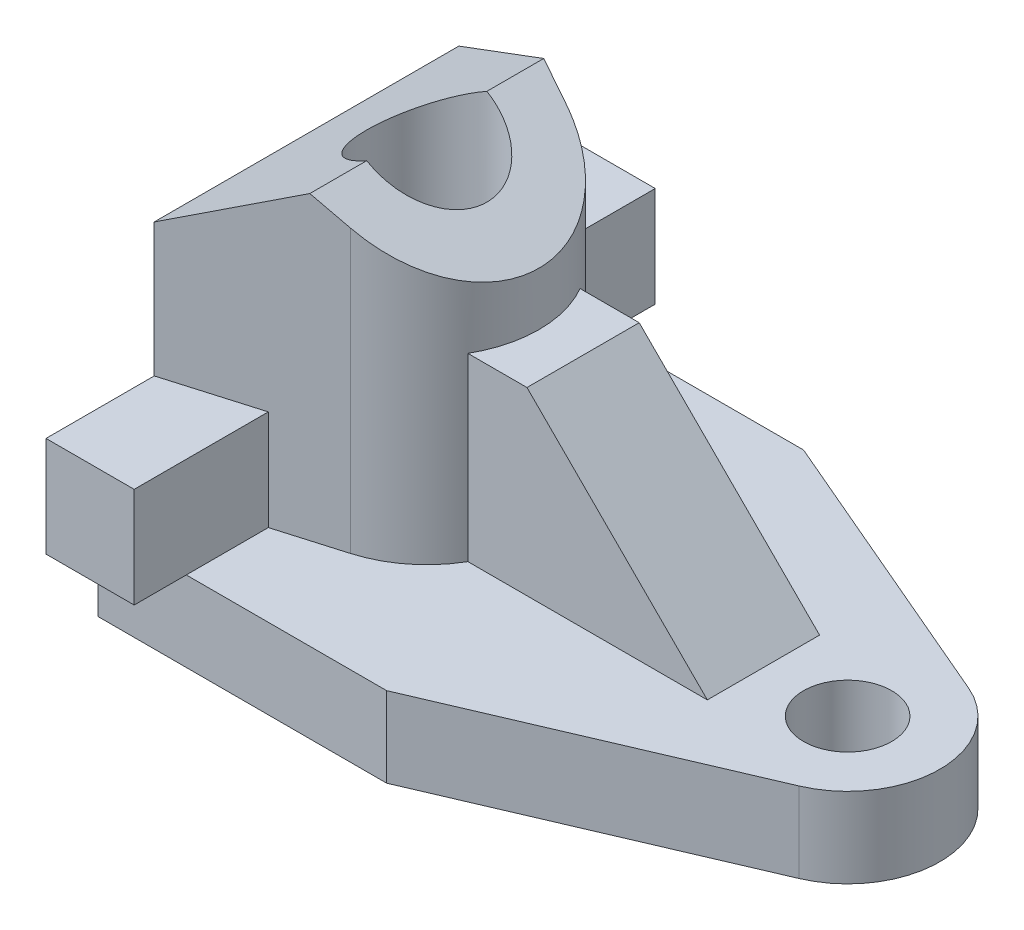
ISO-10303-21;
HEADER;
FILE_DESCRIPTION(('STEP AP214'),'2;1');
FILE_NAME('part.step','',(''),(''),'','','');
FILE_SCHEMA(('AUTOMOTIVE_DESIGN { 1 0 10303 214 1 1 1 1 }'));
ENDSEC;
DATA;
#1=APPLICATION_CONTEXT('core data for automotive mechanical design processes');
#2=APPLICATION_PROTOCOL_DEFINITION('international standard','automotive_design',2000,#1);
#3=PRODUCT_CONTEXT('',#1,'mechanical');
#4=PRODUCT('Part','Part','',(#3));
#5=PRODUCT_RELATED_PRODUCT_CATEGORY('part','',(#4));
#6=PRODUCT_DEFINITION_FORMATION('','',#4);
#7=PRODUCT_DEFINITION_CONTEXT('part definition',#1,'design');
#8=PRODUCT_DEFINITION('design','',#6,#7);
#9=PRODUCT_DEFINITION_SHAPE('','',#8);
#10=(LENGTH_UNIT() NAMED_UNIT(*) SI_UNIT(.MILLI.,.METRE.));
#11=(NAMED_UNIT(*) PLANE_ANGLE_UNIT() SI_UNIT($,.RADIAN.));
#12=(NAMED_UNIT(*) SI_UNIT($,.STERADIAN.) SOLID_ANGLE_UNIT());
#13=UNCERTAINTY_MEASURE_WITH_UNIT(LENGTH_MEASURE(1.E-05),#10,'distance_accuracy_value','');
#14=(GEOMETRIC_REPRESENTATION_CONTEXT(3) GLOBAL_UNCERTAINTY_ASSIGNED_CONTEXT((#13)) GLOBAL_UNIT_ASSIGNED_CONTEXT((#10,
#11,#12)) REPRESENTATION_CONTEXT('',''));
#15=CARTESIAN_POINT('',(0.,0.,0.));
#16=DIRECTION('',(0.,0.,1.));
#17=DIRECTION('',(1.,0.,0.));
#18=AXIS2_PLACEMENT_3D('',#15,#16,#17);
#19=CARTESIAN_POINT('',(-0.226156015931768,47.5,-0.769585411877745));
#20=DIRECTION('',(-0.281945282430885,0.,-0.959430486129646));
#21=DIRECTION('',(-0.959430486129646,0.,0.281945282430885));
#22=AXIS2_PLACEMENT_3D('',#19,#20,#21);
#23=PLANE('',#22);
#24=DIRECTION('',(0.845975230368215,0.471722076970149,-0.248604488500138));
#25=VECTOR('',#24,1.);
#26=CARTESIAN_POINT('',(-11.8582215805571,70.1621577554175,2.64869872468627));
#27=LINE('',#26,#25);
#28=CARTESIAN_POINT('',(-67.5,39.13588849821,19.));
#29=VERTEX_POINT('',#28);
#30=CARTESIAN_POINT('',(-52.5,47.5,14.5919899381936));
#31=VERTEX_POINT('',#30);
#32=EDGE_CURVE('E52',#29,#31,#27,.T.);
#33=ORIENTED_EDGE('',*,*,#32,.F.);
#34=DIRECTION('',(0.,-1.,0.));
#35=VECTOR('',#34,1.);
#36=CARTESIAN_POINT('',(-67.5,47.5,19.));
#37=LINE('',#36,#35);
#38=CARTESIAN_POINT('',(-67.5,22.5,19.));
#39=VERTEX_POINT('',#38);
#40=EDGE_CURVE('E258',#29,#39,#37,.T.);
#41=ORIENTED_EDGE('',*,*,#40,.T.);
#42=DIRECTION('',(0.959430486129646,0.,-0.281945282430885));
#43=VECTOR('',#42,1.);
#44=CARTESIAN_POINT('',(-0.226156015931768,22.5,-0.769585411877745));
#45=LINE('',#44,#43);
#46=CARTESIAN_POINT('',(-56.5,22.5,15.7674592880086));
#47=VERTEX_POINT('',#46);
#48=EDGE_CURVE('E203',#39,#47,#45,.T.);
#49=ORIENTED_EDGE('',*,*,#48,.T.);
#50=DIRECTION('',(0.,-1.,0.));
#51=VECTOR('',#50,1.);
#52=CARTESIAN_POINT('',(-56.5,22.5,15.7674592880086));
#53=LINE('',#52,#51);
#54=CARTESIAN_POINT('',(-56.5,10.,15.7674592880086));
#55=VERTEX_POINT('',#54);
#56=EDGE_CURVE('E266',#47,#55,#53,.T.);
#57=ORIENTED_EDGE('',*,*,#56,.T.);
#58=DIRECTION('',(-0.959430486129646,0.,0.281945282430885));
#59=VECTOR('',#58,1.);
#60=CARTESIAN_POINT('',(-0.226156015931768,10.,-0.769585411877745));
#61=LINE('',#60,#59);
#62=CARTESIAN_POINT('',(-48.5527660459676,10.,13.432026805815));
#63=VERTEX_POINT('',#62);
#64=EDGE_CURVE('E269',#63,#55,#61,.T.);
#65=ORIENTED_EDGE('',*,*,#64,.F.);
#66=DIRECTION('',(0.,-1.,0.));
#67=VECTOR('',#66,1.);
#68=CARTESIAN_POINT('',(-48.5527660459676,47.5,13.432026805815));
#69=LINE('',#68,#67);
#70=CARTESIAN_POINT('',(-48.5527660459676,45.1417782203444,13.432026805815));
#71=VERTEX_POINT('',#70);
#72=EDGE_CURVE('E256',#71,#63,#69,.T.);
#73=ORIENTED_EDGE('',*,*,#72,.F.);
#74=DIRECTION('',(0.832383447651175,-0.497296283457059,-0.244610307501832));
#75=VECTOR('',#74,1.);
#76=CARTESIAN_POINT('',(-13.1536654813518,23.9930622070926,3.02938737463351));
#77=LINE('',#76,#75);
#78=EDGE_CURVE('E213',#31,#71,#77,.T.);
#79=ORIENTED_EDGE('',*,*,#78,.F.);
#80=EDGE_LOOP('',(#33,#41,#49,#57,#65,#73,#79));
#81=FACE_BOUND('',#80,.T.);
#82=ADVANCED_FACE('F37',(#81),#23,.F.);
#83=CARTESIAN_POINT('',(-52.5,47.5,0.));
#84=DIRECTION('',(0.,-1.,0.));
#85=DIRECTION('',(0.,0.,-1.));
#86=AXIS2_PLACEMENT_3D('',#83,#84,#85);
#87=CYLINDRICAL_SURFACE('',#86,14.);
#88=DIRECTION('',(0.,-1.,0.));
#89=VECTOR('',#88,1.);
#90=CARTESIAN_POINT('',(-48.5527660459676,47.5,-13.432026805815));
#91=LINE('',#90,#89);
#92=CARTESIAN_POINT('',(-48.5527660459676,45.1417782203444,-13.432026805815));
#93=VERTEX_POINT('',#92);
#94=CARTESIAN_POINT('',(-48.5527660459676,10.,-13.432026805815));
#95=VERTEX_POINT('',#94);
#96=EDGE_CURVE('E254',#93,#95,#91,.T.);
#97=ORIENTED_EDGE('',*,*,#96,.F.);
#98=CARTESIAN_POINT('',(-52.5,47.5,0.));
#99=DIRECTION('',(0.512876723767168,0.858462268371684,0.));
#100=DIRECTION('',(0.858462268371684,-0.512876723767168,0.));
#101=AXIS2_PLACEMENT_3D('',#98,#99,#100);
#102=ELLIPSE('',#101,16.3082298614649,14.);
#103=EDGE_CURVE('E60',#71,#93,#102,.T.);
#104=ORIENTED_EDGE('',*,*,#103,.F.);
#105=ORIENTED_EDGE('',*,*,#72,.T.);
#106=CARTESIAN_POINT('',(-52.5,10.,0.));
#107=DIRECTION('',(0.,1.,0.));
#108=DIRECTION('',(0.,0.,1.));
#109=AXIS2_PLACEMENT_3D('',#106,#107,#108);
#110=CIRCLE('',#109,14.);
#111=CARTESIAN_POINT('',(-40.3756443470179,10.,7.));
#112=VERTEX_POINT('',#111);
#113=EDGE_CURVE('E271',#112,#63,#110,.F.);
#114=ORIENTED_EDGE('',*,*,#113,.F.);
#115=DIRECTION('',(0.,-1.,0.));
#116=VECTOR('',#115,1.);
#117=CARTESIAN_POINT('',(-40.3756443470179,47.5,7.));
#118=LINE('',#117,#116);
#119=CARTESIAN_POINT('',(-40.3756443470179,32.5,7.));
#120=VERTEX_POINT('',#119);
#121=EDGE_CURVE('E237',#112,#120,#118,.F.);
#122=ORIENTED_EDGE('',*,*,#121,.T.);
#123=CARTESIAN_POINT('',(-52.5,32.5,0.));
#124=DIRECTION('',(0.,-1.,0.));
#125=DIRECTION('',(0.,0.,-1.));
#126=AXIS2_PLACEMENT_3D('',#123,#124,#125);
#127=CIRCLE('',#126,14.);
#128=CARTESIAN_POINT('',(-40.3756443470179,32.5,-7.));
#129=VERTEX_POINT('',#128);
#130=EDGE_CURVE('E242',#120,#129,#127,.F.);
#131=ORIENTED_EDGE('',*,*,#130,.T.);
#132=DIRECTION('',(0.,-1.,0.));
#133=VECTOR('',#132,1.);
#134=CARTESIAN_POINT('',(-40.3756443470179,47.5,-7.));
#135=LINE('',#134,#133);
#136=CARTESIAN_POINT('',(-40.3756443470179,10.,-7.));
#137=VERTEX_POINT('',#136);
#138=EDGE_CURVE('E232',#137,#129,#135,.F.);
#139=ORIENTED_EDGE('',*,*,#138,.F.);
#140=EDGE_CURVE('E272',#95,#137,#110,.F.);
#141=ORIENTED_EDGE('',*,*,#140,.F.);
#142=EDGE_LOOP('',(#97,#104,#105,#114,#122,#131,#139,#141));
#143=FACE_BOUND('',#142,.T.);
#144=ADVANCED_FACE('F388',(#143),#87,.T.);
#145=CARTESIAN_POINT('',(-0.226156015931768,47.5,0.769585411877745));
#146=DIRECTION('',(-0.281945282430885,0.,0.959430486129646));
#147=DIRECTION('',(0.959430486129646,0.,0.281945282430885));
#148=AXIS2_PLACEMENT_3D('',#145,#146,#147);
#149=PLANE('',#148);
#150=DIRECTION('',(-0.845975230368215,-0.471722076970149,-0.248604488500138));
#151=VECTOR('',#150,1.);
#152=CARTESIAN_POINT('',(-11.8582215805571,70.1621577554175,-2.64869872468627));
#153=LINE('',#152,#151);
#154=CARTESIAN_POINT('',(-52.5,47.5,-14.5919899381936));
#155=VERTEX_POINT('',#154);
#156=CARTESIAN_POINT('',(-67.5,39.13588849821,-19.));
#157=VERTEX_POINT('',#156);
#158=EDGE_CURVE('E215',#155,#157,#153,.T.);
#159=ORIENTED_EDGE('',*,*,#158,.F.);
#160=DIRECTION('',(-0.832383447651175,0.497296283457059,-0.244610307501832));
#161=VECTOR('',#160,1.);
#162=CARTESIAN_POINT('',(-13.1536654813518,23.9930622070926,-3.02938737463351));
#163=LINE('',#162,#161);
#164=EDGE_CURVE('E208',#93,#155,#163,.T.);
#165=ORIENTED_EDGE('',*,*,#164,.F.);
#166=ORIENTED_EDGE('',*,*,#96,.T.);
#167=DIRECTION('',(0.959430486129646,0.,0.281945282430885));
#168=VECTOR('',#167,1.);
#169=CARTESIAN_POINT('',(-0.226156015931768,10.,0.769585411877745));
#170=LINE('',#169,#168);
#171=CARTESIAN_POINT('',(-56.5,10.,-15.7674592880086));
#172=VERTEX_POINT('',#171);
#173=EDGE_CURVE('E263',#172,#95,#170,.T.);
#174=ORIENTED_EDGE('',*,*,#173,.F.);
#175=DIRECTION('',(0.,1.,0.));
#176=VECTOR('',#175,1.);
#177=CARTESIAN_POINT('',(-56.5,22.5,-15.7674592880086));
#178=LINE('',#177,#176);
#179=CARTESIAN_POINT('',(-56.5,22.5,-15.7674592880086));
#180=VERTEX_POINT('',#179);
#181=EDGE_CURVE('E260',#172,#180,#178,.T.);
#182=ORIENTED_EDGE('',*,*,#181,.T.);
#183=DIRECTION('',(-0.959430486129646,0.,-0.281945282430885));
#184=VECTOR('',#183,1.);
#185=CARTESIAN_POINT('',(-0.226156015931768,22.5,0.769585411877745));
#186=LINE('',#185,#184);
#187=CARTESIAN_POINT('',(-67.5,22.5,-19.));
#188=VERTEX_POINT('',#187);
#189=EDGE_CURVE('E364',#180,#188,#186,.T.);
#190=ORIENTED_EDGE('',*,*,#189,.T.);
#191=DIRECTION('',(0.,-1.,0.));
#192=VECTOR('',#191,1.);
#193=CARTESIAN_POINT('',(-67.5,47.5,-19.));
#194=LINE('',#193,#192);
#195=EDGE_CURVE('E252',#157,#188,#194,.T.);
#196=ORIENTED_EDGE('',*,*,#195,.F.);
#197=EDGE_LOOP('',(#159,#165,#166,#174,#182,#190,#196));
#198=FACE_BOUND('',#197,.T.);
#199=ADVANCED_FACE('F379',(#198),#149,.F.);
#200=CARTESIAN_POINT('',(-52.5,0.,0.));
#201=DIRECTION('',(0.,1.,0.));
#202=DIRECTION('',(0.,0.,1.));
#203=AXIS2_PLACEMENT_3D('',#200,#201,#202);
#204=CYLINDRICAL_SURFACE('',#203,7.5);
#205=CARTESIAN_POINT('',(-52.5,10.,0.));
#206=DIRECTION('',(0.,1.,0.));
#207=DIRECTION('',(0.,0.,1.));
#208=AXIS2_PLACEMENT_3D('',#205,#206,#207);
#209=CIRCLE('',#208,7.5);
#210=CARTESIAN_POINT('',(-52.5,10.,7.5));
#211=VERTEX_POINT('',#210);
#212=EDGE_CURVE('E247',#211,#211,#209,.T.);
#213=ORIENTED_EDGE('',*,*,#212,.F.);
#214=EDGE_LOOP('',(#213));
#215=FACE_BOUND('',#214,.T.);
#216=CARTESIAN_POINT('',(-52.5,47.5,0.));
#217=DIRECTION('',(-0.48701177071671,0.873395405977942,0.));
#218=DIRECTION('',(0.873395405977942,0.487011770716711,0.));
#219=AXIS2_PLACEMENT_3D('',#216,#217,#218);
#220=ELLIPSE('',#219,8.58717592131394,7.5);
#221=CARTESIAN_POINT('',(-52.5,47.5,7.50000000000003));
#222=VERTEX_POINT('',#221);
#223=CARTESIAN_POINT('',(-52.5,47.5,-7.5));
#224=VERTEX_POINT('',#223);
#225=EDGE_CURVE('E11',#222,#224,#220,.F.);
#226=ORIENTED_EDGE('',*,*,#225,.F.);
#227=CARTESIAN_POINT('',(-52.5,47.5,0.));
#228=DIRECTION('',(0.512876723767168,0.858462268371684,0.));
#229=DIRECTION('',(-0.858462268371684,0.512876723767168,0.));
#230=AXIS2_PLACEMENT_3D('',#227,#228,#229);
#231=ELLIPSE('',#230,8.73655171149906,7.5);
#232=EDGE_CURVE('E45',#224,#222,#231,.F.);
#233=ORIENTED_EDGE('',*,*,#232,.F.);
#234=EDGE_LOOP('',(#226,#233));
#235=FACE_BOUND('',#234,.T.);
#236=ADVANCED_FACE('F191',(#215,#235),#204,.F.);
#237=CARTESIAN_POINT('',(0.,0.,0.));
#238=DIRECTION('',(0.,1.,0.));
#239=DIRECTION('',(0.,0.,1.));
#240=AXIS2_PLACEMENT_3D('',#237,#238,#239);
#241=PLANE('',#240);
#242=CARTESIAN_POINT('',(0.,0.,0.));
#243=DIRECTION('',(0.,1.,0.));
#244=DIRECTION('',(0.,0.,1.));
#245=AXIS2_PLACEMENT_3D('',#242,#243,#244);
#246=CIRCLE('',#245,5.5);
#247=CARTESIAN_POINT('',(0.,0.,5.5));
#248=VERTEX_POINT('',#247);
#249=EDGE_CURVE('E314',#248,#248,#246,.T.);
#250=ORIENTED_EDGE('',*,*,#249,.T.);
#251=EDGE_LOOP('',(#250));
#252=FACE_BOUND('',#251,.T.);
#253=CARTESIAN_POINT('',(-52.5,0.,0.));
#254=DIRECTION('',(0.,1.,0.));
#255=DIRECTION('',(0.,0.,1.));
#256=AXIS2_PLACEMENT_3D('',#253,#254,#255);
#257=CIRCLE('',#256,10.);
#258=CARTESIAN_POINT('',(-52.5,0.,10.));
#259=VERTEX_POINT('',#258);
#260=EDGE_CURVE('E251',#259,#259,#257,.T.);
#261=ORIENTED_EDGE('',*,*,#260,.T.);
#262=EDGE_LOOP('',(#261));
#263=FACE_BOUND('',#262,.T.);
#264=DIRECTION('',(1.,0.,0.));
#265=VECTOR('',#264,1.);
#266=CARTESIAN_POINT('',(-67.5,0.,26.));
#267=LINE('',#266,#265);
#268=CARTESIAN_POINT('',(-67.5,0.,26.));
#269=VERTEX_POINT('',#268);
#270=CARTESIAN_POINT('',(-31.5,0.,26.));
#271=VERTEX_POINT('',#270);
#272=EDGE_CURVE('E339',#269,#271,#267,.T.);
#273=ORIENTED_EDGE('',*,*,#272,.F.);
#274=DIRECTION('',(0.,0.,1.));
#275=VECTOR('',#274,1.);
#276=CARTESIAN_POINT('',(-67.5,0.,-26.));
#277=LINE('',#276,#275);
#278=CARTESIAN_POINT('',(-67.5,0.,-26.));
#279=VERTEX_POINT('',#278);
#280=EDGE_CURVE('E337',#279,#269,#277,.T.);
#281=ORIENTED_EDGE('',*,*,#280,.F.);
#282=DIRECTION('',(-1.,0.,0.));
#283=VECTOR('',#282,1.);
#284=CARTESIAN_POINT('',(-31.5,0.,-26.));
#285=LINE('',#284,#283);
#286=CARTESIAN_POINT('',(-31.5,0.,-26.));
#287=VERTEX_POINT('',#286);
#288=EDGE_CURVE('E317',#287,#279,#285,.T.);
#289=ORIENTED_EDGE('',*,*,#288,.F.);
#290=DIRECTION('',(-0.919252408429625,0.,-0.393668654576833));
#291=VECTOR('',#290,1.);
#292=CARTESIAN_POINT('',(4.52718952763358,0.,-10.5714026969407));
#293=LINE('',#292,#291);
#294=CARTESIAN_POINT('',(4.52718952763358,0.,-10.5714026969407));
#295=VERTEX_POINT('',#294);
#296=EDGE_CURVE('E345',#295,#287,#293,.T.);
#297=ORIENTED_EDGE('',*,*,#296,.F.);
#298=CARTESIAN_POINT('',(0.,0.,0.));
#299=DIRECTION('',(0.,1.,0.));
#300=DIRECTION('',(0.,0.,1.));
#301=AXIS2_PLACEMENT_3D('',#298,#299,#300);
#302=CIRCLE('',#301,11.5);
#303=CARTESIAN_POINT('',(4.52718952763358,0.,10.5714026969407));
#304=VERTEX_POINT('',#303);
#305=EDGE_CURVE('E343',#304,#295,#302,.T.);
#306=ORIENTED_EDGE('',*,*,#305,.F.);
#307=DIRECTION('',(0.919252408429625,0.,-0.393668654576833));
#308=VECTOR('',#307,1.);
#309=CARTESIAN_POINT('',(-31.5,0.,26.));
#310=LINE('',#309,#308);
#311=EDGE_CURVE('E341',#271,#304,#310,.T.);
#312=ORIENTED_EDGE('',*,*,#311,.F.);
#313=EDGE_LOOP('',(#273,#281,#289,#297,#306,#312));
#314=FACE_BOUND('',#313,.T.);
#315=ADVANCED_FACE('F378',(#252,#263,#314),#241,.F.);
#316=CARTESIAN_POINT('',(0.,10.,0.));
#317=DIRECTION('',(0.,1.,0.));
#318=DIRECTION('',(0.,0.,1.));
#319=AXIS2_PLACEMENT_3D('',#316,#317,#318);
#320=PLANE('',#319);
#321=DIRECTION('',(1.,0.,0.));
#322=VECTOR('',#321,1.);
#323=CARTESIAN_POINT('',(0.,10.,7.));
#324=LINE('',#323,#322);
#325=CARTESIAN_POINT('',(-10.5,10.,7.));
#326=VERTEX_POINT('',#325);
#327=EDGE_CURVE('E239',#112,#326,#324,.T.);
#328=ORIENTED_EDGE('',*,*,#327,.F.);
#329=ORIENTED_EDGE('',*,*,#113,.T.);
#330=ORIENTED_EDGE('',*,*,#64,.T.);
#331=DIRECTION('',(0.,0.,-1.));
#332=VECTOR('',#331,1.);
#333=CARTESIAN_POINT('',(-56.5,10.,-32.5));
#334=LINE('',#333,#332);
#335=CARTESIAN_POINT('',(-56.5,10.,26.));
#336=VERTEX_POINT('',#335);
#337=EDGE_CURVE('E294',#336,#55,#334,.T.);
#338=ORIENTED_EDGE('',*,*,#337,.F.);
#339=DIRECTION('',(1.,0.,0.));
#340=VECTOR('',#339,1.);
#341=CARTESIAN_POINT('',(-67.5,10.,26.));
#342=LINE('',#341,#340);
#343=CARTESIAN_POINT('',(-31.5,10.,26.));
#344=VERTEX_POINT('',#343);
#345=EDGE_CURVE('E323',#336,#344,#342,.T.);
#346=ORIENTED_EDGE('',*,*,#345,.T.);
#347=DIRECTION('',(0.919252408429625,0.,-0.393668654576833));
#348=VECTOR('',#347,1.);
#349=CARTESIAN_POINT('',(-31.5,10.,26.));
#350=LINE('',#349,#348);
#351=CARTESIAN_POINT('',(4.52718952763358,10.,10.5714026969407));
#352=VERTEX_POINT('',#351);
#353=EDGE_CURVE('E328',#344,#352,#350,.T.);
#354=ORIENTED_EDGE('',*,*,#353,.T.);
#355=CARTESIAN_POINT('',(0.,10.,0.));
#356=DIRECTION('',(0.,1.,0.));
#357=DIRECTION('',(0.,0.,1.));
#358=AXIS2_PLACEMENT_3D('',#355,#356,#357);
#359=CIRCLE('',#358,11.5);
#360=CARTESIAN_POINT('',(4.52718952763358,10.,-10.5714026969407));
#361=VERTEX_POINT('',#360);
#362=EDGE_CURVE('E330',#352,#361,#359,.T.);
#363=ORIENTED_EDGE('',*,*,#362,.T.);
#364=DIRECTION('',(-0.919252408429625,0.,-0.393668654576833));
#365=VECTOR('',#364,1.);
#366=CARTESIAN_POINT('',(4.52718952763358,10.,-10.5714026969407));
#367=LINE('',#366,#365);
#368=CARTESIAN_POINT('',(-31.5,10.,-26.));
#369=VERTEX_POINT('',#368);
#370=EDGE_CURVE('E332',#361,#369,#367,.T.);
#371=ORIENTED_EDGE('',*,*,#370,.T.);
#372=DIRECTION('',(-1.,0.,0.));
#373=VECTOR('',#372,1.);
#374=CARTESIAN_POINT('',(-31.5,10.,-26.));
#375=LINE('',#374,#373);
#376=CARTESIAN_POINT('',(-56.5,10.,-26.));
#377=VERTEX_POINT('',#376);
#378=EDGE_CURVE('E320',#369,#377,#375,.T.);
#379=ORIENTED_EDGE('',*,*,#378,.T.);
#380=EDGE_CURVE('E293',#172,#377,#334,.T.);
#381=ORIENTED_EDGE('',*,*,#380,.F.);
#382=ORIENTED_EDGE('',*,*,#173,.T.);
#383=ORIENTED_EDGE('',*,*,#140,.T.);
#384=DIRECTION('',(1.,0.,0.));
#385=VECTOR('',#384,1.);
#386=CARTESIAN_POINT('',(0.,10.,-7.));
#387=LINE('',#386,#385);
#388=CARTESIAN_POINT('',(-10.5,10.,-7.));
#389=VERTEX_POINT('',#388);
#390=EDGE_CURVE('E235',#137,#389,#387,.T.);
#391=ORIENTED_EDGE('',*,*,#390,.T.);
#392=DIRECTION('',(0.,0.,1.));
#393=VECTOR('',#392,1.);
#394=CARTESIAN_POINT('',(-10.5,10.,0.));
#395=LINE('',#394,#393);
#396=EDGE_CURVE('E244',#326,#389,#395,.F.);
#397=ORIENTED_EDGE('',*,*,#396,.F.);
#398=EDGE_LOOP('',(#328,#329,#330,#338,#346,#354,#363,#371,#379,#381,#382,#383,#391,#397));
#399=FACE_BOUND('',#398,.T.);
#400=CARTESIAN_POINT('',(0.,10.,0.));
#401=DIRECTION('',(0.,1.,0.));
#402=DIRECTION('',(0.,0.,1.));
#403=AXIS2_PLACEMENT_3D('',#400,#401,#402);
#404=CIRCLE('',#403,5.5);
#405=CARTESIAN_POINT('',(0.,10.,5.5));
#406=VERTEX_POINT('',#405);
#407=EDGE_CURVE('E313',#406,#406,#404,.T.);
#408=ORIENTED_EDGE('',*,*,#407,.F.);
#409=EDGE_LOOP('',(#408));
#410=FACE_BOUND('',#409,.T.);
#411=ADVANCED_FACE('F385',(#399,#410),#320,.T.);
#412=CARTESIAN_POINT('',(-56.5,22.5,-32.5));
#413=DIRECTION('',(-1.,0.,0.));
#414=DIRECTION('',(0.,0.,1.));
#415=AXIS2_PLACEMENT_3D('',#412,#413,#414);
#416=PLANE('',#415);
#417=ORIENTED_EDGE('',*,*,#56,.F.);
#418=DIRECTION('',(0.,0.,-1.));
#419=VECTOR('',#418,1.);
#420=CARTESIAN_POINT('',(-56.5,22.5,-32.5));
#421=LINE('',#420,#419);
#422=CARTESIAN_POINT('',(-56.5,22.5,32.5));
#423=VERTEX_POINT('',#422);
#424=EDGE_CURVE('E276',#423,#47,#421,.T.);
#425=ORIENTED_EDGE('',*,*,#424,.F.);
#426=DIRECTION('',(0.,-1.,0.));
#427=VECTOR('',#426,1.);
#428=CARTESIAN_POINT('',(-56.5,22.5,32.5));
#429=LINE('',#428,#427);
#430=CARTESIAN_POINT('',(-56.5,10.,32.5));
#431=VERTEX_POINT('',#430);
#432=EDGE_CURVE('E288',#423,#431,#429,.T.);
#433=ORIENTED_EDGE('',*,*,#432,.T.);
#434=EDGE_CURVE('E289',#431,#336,#334,.T.);
#435=ORIENTED_EDGE('',*,*,#434,.T.);
#436=ORIENTED_EDGE('',*,*,#337,.T.);
#437=EDGE_LOOP('',(#417,#425,#433,#435,#436));
#438=FACE_BOUND('',#437,.T.);
#439=ADVANCED_FACE('F420',(#438),#416,.F.);
#440=ORIENTED_EDGE('',*,*,#181,.F.);
#441=ORIENTED_EDGE('',*,*,#380,.T.);
#442=CARTESIAN_POINT('',(-56.5,10.,-32.5));
#443=VERTEX_POINT('',#442);
#444=EDGE_CURVE('E275',#377,#443,#334,.T.);
#445=ORIENTED_EDGE('',*,*,#444,.T.);
#446=DIRECTION('',(0.,-1.,0.));
#447=VECTOR('',#446,1.);
#448=CARTESIAN_POINT('',(-56.5,22.5,-32.5));
#449=LINE('',#448,#447);
#450=CARTESIAN_POINT('',(-56.5,22.5,-32.5));
#451=VERTEX_POINT('',#450);
#452=EDGE_CURVE('E310',#451,#443,#449,.T.);
#453=ORIENTED_EDGE('',*,*,#452,.F.);
#454=EDGE_CURVE('E280',#180,#451,#421,.T.);
#455=ORIENTED_EDGE('',*,*,#454,.F.);
#456=EDGE_LOOP('',(#440,#441,#445,#453,#455));
#457=FACE_BOUND('',#456,.T.);
#458=ADVANCED_FACE('F404',(#457),#416,.F.);
#459=CARTESIAN_POINT('',(0.,22.5,0.));
#460=DIRECTION('',(0.,-1.,0.));
#461=DIRECTION('',(0.,0.,-1.));
#462=AXIS2_PLACEMENT_3D('',#459,#460,#461);
#463=PLANE('',#462);
#464=ORIENTED_EDGE('',*,*,#48,.F.);
#465=DIRECTION('',(0.,0.,1.));
#466=VECTOR('',#465,1.);
#467=CARTESIAN_POINT('',(-67.5,22.5,-32.5));
#468=LINE('',#467,#466);
#469=CARTESIAN_POINT('',(-67.5,22.5,32.5));
#470=VERTEX_POINT('',#469);
#471=EDGE_CURVE('E282',#39,#470,#468,.T.);
#472=ORIENTED_EDGE('',*,*,#471,.T.);
#473=DIRECTION('',(1.,0.,0.));
#474=VECTOR('',#473,1.);
#475=CARTESIAN_POINT('',(-56.5,22.5,32.5));
#476=LINE('',#475,#474);
#477=EDGE_CURVE('E286',#470,#423,#476,.T.);
#478=ORIENTED_EDGE('',*,*,#477,.T.);
#479=ORIENTED_EDGE('',*,*,#424,.T.);
#480=EDGE_LOOP('',(#464,#472,#478,#479));
#481=FACE_BOUND('',#480,.T.);
#482=ADVANCED_FACE('F400',(#481),#463,.F.);
#483=ORIENTED_EDGE('',*,*,#189,.F.);
#484=ORIENTED_EDGE('',*,*,#454,.T.);
#485=DIRECTION('',(-1.,0.,0.));
#486=VECTOR('',#485,1.);
#487=CARTESIAN_POINT('',(-56.5,22.5,-32.5));
#488=LINE('',#487,#486);
#489=CARTESIAN_POINT('',(-67.5,22.5,-32.5));
#490=VERTEX_POINT('',#489);
#491=EDGE_CURVE('E279',#451,#490,#488,.T.);
#492=ORIENTED_EDGE('',*,*,#491,.T.);
#493=EDGE_CURVE('E283',#490,#188,#468,.T.);
#494=ORIENTED_EDGE('',*,*,#493,.T.);
#495=EDGE_LOOP('',(#483,#484,#492,#494));
#496=FACE_BOUND('',#495,.T.);
#497=ADVANCED_FACE('F403',(#496),#463,.F.);
#498=CARTESIAN_POINT('',(-31.5,10.,-26.));
#499=DIRECTION('',(0.,0.,1.));
#500=DIRECTION('',(1.,0.,0.));
#501=AXIS2_PLACEMENT_3D('',#498,#499,#500);
#502=PLANE('',#501);
#503=ORIENTED_EDGE('',*,*,#288,.T.);
#504=DIRECTION('',(0.,-1.,0.));
#505=VECTOR('',#504,1.);
#506=CARTESIAN_POINT('',(-67.5,10.,-26.));
#507=LINE('',#506,#505);
#508=CARTESIAN_POINT('',(-67.5,10.,-26.));
#509=VERTEX_POINT('',#508);
#510=EDGE_CURVE('E361',#509,#279,#507,.T.);
#511=ORIENTED_EDGE('',*,*,#510,.F.);
#512=EDGE_CURVE('E324',#377,#509,#375,.T.);
#513=ORIENTED_EDGE('',*,*,#512,.F.);
#514=ORIENTED_EDGE('',*,*,#378,.F.);
#515=DIRECTION('',(0.,-1.,0.));
#516=VECTOR('',#515,1.);
#517=CARTESIAN_POINT('',(-31.5,10.,-26.));
#518=LINE('',#517,#516);
#519=EDGE_CURVE('E334',#369,#287,#518,.T.);
#520=ORIENTED_EDGE('',*,*,#519,.T.);
#521=EDGE_LOOP('',(#503,#511,#513,#514,#520));
#522=FACE_BOUND('',#521,.T.);
#523=ADVANCED_FACE('F39',(#522),#502,.F.);
#524=CARTESIAN_POINT('',(-67.5,10.,-26.));
#525=DIRECTION('',(1.,0.,0.));
#526=DIRECTION('',(0.,0.,-1.));
#527=AXIS2_PLACEMENT_3D('',#524,#525,#526);
#528=PLANE('',#527);
#529=ORIENTED_EDGE('',*,*,#40,.F.);
#530=DIRECTION('',(0.,0.,-1.));
#531=VECTOR('',#530,1.);
#532=CARTESIAN_POINT('',(-67.5,39.13588849821,173.491189884333));
#533=LINE('',#532,#531);
#534=EDGE_CURVE('E206',#29,#157,#533,.T.);
#535=ORIENTED_EDGE('',*,*,#534,.T.);
#536=ORIENTED_EDGE('',*,*,#195,.T.);
#537=ORIENTED_EDGE('',*,*,#493,.F.);
#538=DIRECTION('',(0.,-1.,0.));
#539=VECTOR('',#538,1.);
#540=CARTESIAN_POINT('',(-67.5,22.5,-32.5));
#541=LINE('',#540,#539);
#542=CARTESIAN_POINT('',(-67.5,10.,-32.5));
#543=VERTEX_POINT('',#542);
#544=EDGE_CURVE('E307',#490,#543,#541,.T.);
#545=ORIENTED_EDGE('',*,*,#544,.T.);
#546=DIRECTION('',(0.,0.,1.));
#547=VECTOR('',#546,1.);
#548=CARTESIAN_POINT('',(-67.5,10.,-32.5));
#549=LINE('',#548,#547);
#550=EDGE_CURVE('E297',#543,#509,#549,.T.);
#551=ORIENTED_EDGE('',*,*,#550,.T.);
#552=ORIENTED_EDGE('',*,*,#510,.T.);
#553=ORIENTED_EDGE('',*,*,#280,.T.);
#554=DIRECTION('',(0.,-1.,0.));
#555=VECTOR('',#554,1.);
#556=CARTESIAN_POINT('',(-67.5,10.,26.));
#557=LINE('',#556,#555);
#558=CARTESIAN_POINT('',(-67.5,10.,26.));
#559=VERTEX_POINT('',#558);
#560=EDGE_CURVE('E358',#559,#269,#557,.T.);
#561=ORIENTED_EDGE('',*,*,#560,.F.);
#562=CARTESIAN_POINT('',(-67.5,10.,32.5));
#563=VERTEX_POINT('',#562);
#564=EDGE_CURVE('E296',#559,#563,#549,.T.);
#565=ORIENTED_EDGE('',*,*,#564,.T.);
#566=DIRECTION('',(0.,-1.,0.));
#567=VECTOR('',#566,1.);
#568=CARTESIAN_POINT('',(-67.5,22.5,32.5));
#569=LINE('',#568,#567);
#570=EDGE_CURVE('E304',#470,#563,#569,.T.);
#571=ORIENTED_EDGE('',*,*,#570,.F.);
#572=ORIENTED_EDGE('',*,*,#471,.F.);
#573=EDGE_LOOP('',(#529,#535,#536,#537,#545,#551,#552,#553,#561,#565,#571,#572));
#574=FACE_BOUND('',#573,.T.);
#575=ADVANCED_FACE('F445',(#574),#528,.F.);
#576=CARTESIAN_POINT('',(-67.5,10.,26.));
#577=DIRECTION('',(0.,0.,-1.));
#578=DIRECTION('',(-1.,0.,0.));
#579=AXIS2_PLACEMENT_3D('',#576,#577,#578);
#580=PLANE('',#579);
#581=ORIENTED_EDGE('',*,*,#272,.T.);
#582=DIRECTION('',(0.,-1.,0.));
#583=VECTOR('',#582,1.);
#584=CARTESIAN_POINT('',(-31.5,10.,26.));
#585=LINE('',#584,#583);
#586=EDGE_CURVE('E355',#344,#271,#585,.T.);
#587=ORIENTED_EDGE('',*,*,#586,.F.);
#588=ORIENTED_EDGE('',*,*,#345,.F.);
#589=EDGE_CURVE('E325',#559,#336,#342,.T.);
#590=ORIENTED_EDGE('',*,*,#589,.F.);
#591=ORIENTED_EDGE('',*,*,#560,.T.);
#592=EDGE_LOOP('',(#581,#587,#588,#590,#591));
#593=FACE_BOUND('',#592,.T.);
#594=ADVANCED_FACE('F442',(#593),#580,.F.);
#595=CARTESIAN_POINT('',(-31.5,10.,26.));
#596=DIRECTION('',(-0.393668654576833,0.,-0.919252408429625));
#597=DIRECTION('',(-0.919252408429625,0.,0.393668654576833));
#598=AXIS2_PLACEMENT_3D('',#595,#596,#597);
#599=PLANE('',#598);
#600=ORIENTED_EDGE('',*,*,#311,.T.);
#601=DIRECTION('',(0.,-1.,0.));
#602=VECTOR('',#601,1.);
#603=CARTESIAN_POINT('',(4.52718952763358,10.,10.5714026969407));
#604=LINE('',#603,#602);
#605=EDGE_CURVE('E352',#352,#304,#604,.T.);
#606=ORIENTED_EDGE('',*,*,#605,.F.);
#607=ORIENTED_EDGE('',*,*,#353,.F.);
#608=ORIENTED_EDGE('',*,*,#586,.T.);
#609=EDGE_LOOP('',(#600,#606,#607,#608));
#610=FACE_BOUND('',#609,.T.);
#611=ADVANCED_FACE('F438',(#610),#599,.F.);
#612=CARTESIAN_POINT('',(0.,10.,0.));
#613=DIRECTION('',(0.,-1.,0.));
#614=DIRECTION('',(0.,0.,-1.));
#615=AXIS2_PLACEMENT_3D('',#612,#613,#614);
#616=CYLINDRICAL_SURFACE('',#615,11.5);
#617=ORIENTED_EDGE('',*,*,#305,.T.);
#618=DIRECTION('',(0.,-1.,0.));
#619=VECTOR('',#618,1.);
#620=CARTESIAN_POINT('',(4.52718952763358,10.,-10.5714026969407));
#621=LINE('',#620,#619);
#622=EDGE_CURVE('E349',#361,#295,#621,.T.);
#623=ORIENTED_EDGE('',*,*,#622,.F.);
#624=ORIENTED_EDGE('',*,*,#362,.F.);
#625=ORIENTED_EDGE('',*,*,#605,.T.);
#626=EDGE_LOOP('',(#617,#623,#624,#625));
#627=FACE_BOUND('',#626,.T.);
#628=ADVANCED_FACE('F434',(#627),#616,.T.);
#629=CARTESIAN_POINT('',(4.52718952763358,10.,-10.5714026969407));
#630=DIRECTION('',(-0.393668654576833,0.,0.919252408429625));
#631=DIRECTION('',(0.919252408429625,0.,0.393668654576833));
#632=AXIS2_PLACEMENT_3D('',#629,#630,#631);
#633=PLANE('',#632);
#634=ORIENTED_EDGE('',*,*,#296,.T.);
#635=ORIENTED_EDGE('',*,*,#519,.F.);
#636=ORIENTED_EDGE('',*,*,#370,.F.);
#637=ORIENTED_EDGE('',*,*,#622,.T.);
#638=EDGE_LOOP('',(#634,#635,#636,#637));
#639=FACE_BOUND('',#638,.T.);
#640=ADVANCED_FACE('F427',(#639),#633,.F.);
#641=CARTESIAN_POINT('',(0.,0.,0.));
#642=DIRECTION('',(0.,1.,0.));
#643=DIRECTION('',(0.,0.,1.));
#644=AXIS2_PLACEMENT_3D('',#641,#642,#643);
#645=CYLINDRICAL_SURFACE('',#644,5.5);
#646=ORIENTED_EDGE('',*,*,#249,.F.);
#647=EDGE_LOOP('',(#646));
#648=FACE_BOUND('',#647,.T.);
#649=ORIENTED_EDGE('',*,*,#407,.T.);
#650=EDGE_LOOP('',(#649));
#651=FACE_BOUND('',#650,.T.);
#652=ADVANCED_FACE('F424',(#648,#651),#645,.F.);
#653=CARTESIAN_POINT('',(0.,10.,0.));
#654=DIRECTION('',(0.,-1.,0.));
#655=DIRECTION('',(0.,0.,-1.));
#656=AXIS2_PLACEMENT_3D('',#653,#654,#655);
#657=PLANE('',#656);
#658=ORIENTED_EDGE('',*,*,#444,.F.);
#659=ORIENTED_EDGE('',*,*,#512,.T.);
#660=ORIENTED_EDGE('',*,*,#550,.F.);
#661=DIRECTION('',(-1.,0.,0.));
#662=VECTOR('',#661,1.);
#663=CARTESIAN_POINT('',(-56.5,10.,-32.5));
#664=LINE('',#663,#662);
#665=EDGE_CURVE('E292',#443,#543,#664,.T.);
#666=ORIENTED_EDGE('',*,*,#665,.F.);
#667=EDGE_LOOP('',(#658,#659,#660,#666));
#668=FACE_BOUND('',#667,.T.);
#669=ADVANCED_FACE('F412',(#668),#657,.T.);
#670=CARTESIAN_POINT('',(-56.5,22.5,-32.5));
#671=DIRECTION('',(0.,0.,1.));
#672=DIRECTION('',(1.,0.,0.));
#673=AXIS2_PLACEMENT_3D('',#670,#671,#672);
#674=PLANE('',#673);
#675=ORIENTED_EDGE('',*,*,#665,.T.);
#676=ORIENTED_EDGE('',*,*,#544,.F.);
#677=ORIENTED_EDGE('',*,*,#491,.F.);
#678=ORIENTED_EDGE('',*,*,#452,.T.);
#679=EDGE_LOOP('',(#675,#676,#677,#678));
#680=FACE_BOUND('',#679,.T.);
#681=ADVANCED_FACE('F415',(#680),#674,.F.);
#682=CARTESIAN_POINT('',(-56.5,22.5,32.5));
#683=DIRECTION('',(0.,0.,-1.));
#684=DIRECTION('',(-1.,0.,0.));
#685=AXIS2_PLACEMENT_3D('',#682,#683,#684);
#686=PLANE('',#685);
#687=DIRECTION('',(1.,0.,0.));
#688=VECTOR('',#687,1.);
#689=CARTESIAN_POINT('',(-56.5,10.,32.5));
#690=LINE('',#689,#688);
#691=EDGE_CURVE('E300',#563,#431,#690,.T.);
#692=ORIENTED_EDGE('',*,*,#691,.T.);
#693=ORIENTED_EDGE('',*,*,#432,.F.);
#694=ORIENTED_EDGE('',*,*,#477,.F.);
#695=ORIENTED_EDGE('',*,*,#570,.T.);
#696=EDGE_LOOP('',(#692,#693,#694,#695));
#697=FACE_BOUND('',#696,.T.);
#698=ADVANCED_FACE('F410',(#697),#686,.F.);
#699=ORIENTED_EDGE('',*,*,#564,.F.);
#700=ORIENTED_EDGE('',*,*,#589,.T.);
#701=ORIENTED_EDGE('',*,*,#434,.F.);
#702=ORIENTED_EDGE('',*,*,#691,.F.);
#703=EDGE_LOOP('',(#699,#700,#701,#702));
#704=FACE_BOUND('',#703,.T.);
#705=ADVANCED_FACE('F406',(#704),#657,.T.);
#706=CARTESIAN_POINT('',(-52.5,10.,0.));
#707=DIRECTION('',(0.,1.,0.));
#708=DIRECTION('',(0.,0.,1.));
#709=AXIS2_PLACEMENT_3D('',#706,#707,#708);
#710=CYLINDRICAL_SURFACE('',#709,10.);
#711=ORIENTED_EDGE('',*,*,#260,.F.);
#712=EDGE_LOOP('',(#711));
#713=FACE_BOUND('',#712,.T.);
#714=CARTESIAN_POINT('',(-52.5,10.,0.));
#715=DIRECTION('',(0.,1.,0.));
#716=DIRECTION('',(0.,0.,1.));
#717=AXIS2_PLACEMENT_3D('',#714,#715,#716);
#718=CIRCLE('',#717,10.);
#719=CARTESIAN_POINT('',(-52.5,10.,10.));
#720=VERTEX_POINT('',#719);
#721=EDGE_CURVE('E248',#720,#720,#718,.T.);
#722=ORIENTED_EDGE('',*,*,#721,.T.);
#723=EDGE_LOOP('',(#722));
#724=FACE_BOUND('',#723,.T.);
#725=ADVANCED_FACE('F409',(#713,#724),#710,.F.);
#726=CARTESIAN_POINT('',(-42.5,10.,0.));
#727=DIRECTION('',(0.,1.,0.));
#728=DIRECTION('',(0.,0.,1.));
#729=AXIS2_PLACEMENT_3D('',#726,#727,#728);
#730=PLANE('',#729);
#731=ORIENTED_EDGE('',*,*,#212,.T.);
#732=EDGE_LOOP('',(#731));
#733=FACE_BOUND('',#732,.T.);
#734=ORIENTED_EDGE('',*,*,#721,.F.);
#735=EDGE_LOOP('',(#734));
#736=FACE_BOUND('',#735,.T.);
#737=ADVANCED_FACE('F374',(#733,#736),#730,.F.);
#738=CARTESIAN_POINT('',(-38.5,32.5,0.));
#739=DIRECTION('',(0.,-1.,0.));
#740=DIRECTION('',(1.,0.,0.));
#741=AXIS2_PLACEMENT_3D('',#738,#739,#740);
#742=PLANE('',#741);
#743=ORIENTED_EDGE('',*,*,#130,.F.);
#744=DIRECTION('',(1.,0.,0.));
#745=VECTOR('',#744,1.);
#746=CARTESIAN_POINT('',(-28.,32.5,7.));
#747=LINE('',#746,#745);
#748=CARTESIAN_POINT('',(-32.9999999999999,32.5,7.));
#749=VERTEX_POINT('',#748);
#750=EDGE_CURVE('E220',#120,#749,#747,.T.);
#751=ORIENTED_EDGE('',*,*,#750,.T.);
#752=DIRECTION('',(0.,0.,1.));
#753=VECTOR('',#752,1.);
#754=CARTESIAN_POINT('',(-32.9999999999999,32.5,0.));
#755=LINE('',#754,#753);
#756=CARTESIAN_POINT('',(-32.9999999999999,32.5,-7.));
#757=VERTEX_POINT('',#756);
#758=EDGE_CURVE('E222',#757,#749,#755,.T.);
#759=ORIENTED_EDGE('',*,*,#758,.F.);
#760=DIRECTION('',(1.,0.,0.));
#761=VECTOR('',#760,1.);
#762=CARTESIAN_POINT('',(-28.,32.5,-7.));
#763=LINE('',#762,#761);
#764=EDGE_CURVE('E226',#129,#757,#763,.T.);
#765=ORIENTED_EDGE('',*,*,#764,.F.);
#766=EDGE_LOOP('',(#743,#751,#759,#765));
#767=FACE_BOUND('',#766,.T.);
#768=ADVANCED_FACE('F475',(#767),#742,.F.);
#769=CARTESIAN_POINT('',(-28.,23.75,7.));
#770=DIRECTION('',(0.,0.,1.));
#771=DIRECTION('',(1.,0.,0.));
#772=AXIS2_PLACEMENT_3D('',#769,#770,#771);
#773=PLANE('',#772);
#774=ORIENTED_EDGE('',*,*,#121,.F.);
#775=ORIENTED_EDGE('',*,*,#327,.T.);
#776=DIRECTION('',(0.707106781186546,-0.707106781186549,0.));
#777=VECTOR('',#776,1.);
#778=CARTESIAN_POINT('',(-32.9999999999999,32.5,7.));
#779=LINE('',#778,#777);
#780=EDGE_CURVE('E223',#749,#326,#779,.T.);
#781=ORIENTED_EDGE('',*,*,#780,.F.);
#782=ORIENTED_EDGE('',*,*,#750,.F.);
#783=EDGE_LOOP('',(#774,#775,#781,#782));
#784=FACE_BOUND('',#783,.T.);
#785=ADVANCED_FACE('F466',(#784),#773,.T.);
#786=CARTESIAN_POINT('',(-28.,23.75,-7.));
#787=DIRECTION('',(0.,0.,1.));
#788=DIRECTION('',(1.,0.,0.));
#789=AXIS2_PLACEMENT_3D('',#786,#787,#788);
#790=PLANE('',#789);
#791=ORIENTED_EDGE('',*,*,#390,.F.);
#792=ORIENTED_EDGE('',*,*,#138,.T.);
#793=ORIENTED_EDGE('',*,*,#764,.T.);
#794=DIRECTION('',(0.707106781186546,-0.707106781186549,0.));
#795=VECTOR('',#794,1.);
#796=CARTESIAN_POINT('',(-32.9999999999999,32.5,-7.));
#797=LINE('',#796,#795);
#798=EDGE_CURVE('E219',#757,#389,#797,.T.);
#799=ORIENTED_EDGE('',*,*,#798,.T.);
#800=EDGE_LOOP('',(#791,#792,#793,#799));
#801=FACE_BOUND('',#800,.T.);
#802=ADVANCED_FACE('F479',(#801),#790,.F.);
#803=CARTESIAN_POINT('',(-32.9999999999999,32.5,0.));
#804=DIRECTION('',(-0.707106781186549,-0.707106781186546,0.));
#805=DIRECTION('',(0.707106781186546,-0.707106781186549,0.));
#806=AXIS2_PLACEMENT_3D('',#803,#804,#805);
#807=PLANE('',#806);
#808=ORIENTED_EDGE('',*,*,#780,.T.);
#809=ORIENTED_EDGE('',*,*,#396,.T.);
#810=ORIENTED_EDGE('',*,*,#798,.F.);
#811=ORIENTED_EDGE('',*,*,#758,.T.);
#812=EDGE_LOOP('',(#808,#809,#810,#811));
#813=FACE_BOUND('',#812,.T.);
#814=ADVANCED_FACE('F469',(#813),#807,.F.);
#815=CARTESIAN_POINT('',(-67.5,39.13588849821,173.491189884333));
#816=DIRECTION('',(-0.48701177071671,0.873395405977942,0.));
#817=DIRECTION('',(-0.873395405977942,-0.48701177071671,0.));
#818=AXIS2_PLACEMENT_3D('',#815,#816,#817);
#819=PLANE('',#818);
#820=ORIENTED_EDGE('',*,*,#534,.F.);
#821=ORIENTED_EDGE('',*,*,#32,.T.);
#822=DIRECTION('',(0.,0.,-1.));
#823=VECTOR('',#822,1.);
#824=CARTESIAN_POINT('',(-52.5,47.5,173.491189884333));
#825=LINE('',#824,#823);
#826=EDGE_CURVE('E200',#31,#222,#825,.T.);
#827=ORIENTED_EDGE('',*,*,#826,.T.);
#828=ORIENTED_EDGE('',*,*,#225,.T.);
#829=EDGE_CURVE('E202',#224,#155,#825,.T.);
#830=ORIENTED_EDGE('',*,*,#829,.T.);
#831=ORIENTED_EDGE('',*,*,#158,.T.);
#832=EDGE_LOOP('',(#820,#821,#827,#828,#830,#831));
#833=FACE_BOUND('',#832,.T.);
#834=ADVANCED_FACE('F205',(#833),#819,.T.);
#835=CARTESIAN_POINT('',(-52.5,47.5,173.491189884333));
#836=DIRECTION('',(0.512876723767168,0.858462268371684,0.));
#837=DIRECTION('',(-0.858462268371684,0.512876723767168,0.));
#838=AXIS2_PLACEMENT_3D('',#835,#836,#837);
#839=PLANE('',#838);
#840=ORIENTED_EDGE('',*,*,#826,.F.);
#841=ORIENTED_EDGE('',*,*,#78,.T.);
#842=ORIENTED_EDGE('',*,*,#103,.T.);
#843=ORIENTED_EDGE('',*,*,#164,.T.);
#844=ORIENTED_EDGE('',*,*,#829,.F.);
#845=ORIENTED_EDGE('',*,*,#232,.T.);
#846=EDGE_LOOP('',(#840,#841,#842,#843,#844,#845));
#847=FACE_BOUND('',#846,.T.);
#848=ADVANCED_FACE('F198',(#847),#839,.T.);
#849=CLOSED_SHELL('',(#82,#144,#199,#236,#315,#411,#439,#458,#482,#497,#523,#575,#594,#611,#628,
#640,#652,#669,#681,#698,#705,#725,#737,#768,#785,#802,#814,#834,#848));
#850=MANIFOLD_SOLID_BREP('B2',#849);
#851=ADVANCED_BREP_SHAPE_REPRESENTATION('',(#18,#850),#14);
#852=SHAPE_DEFINITION_REPRESENTATION(#9,#851);
ENDSEC;
END-ISO-10303-21;
